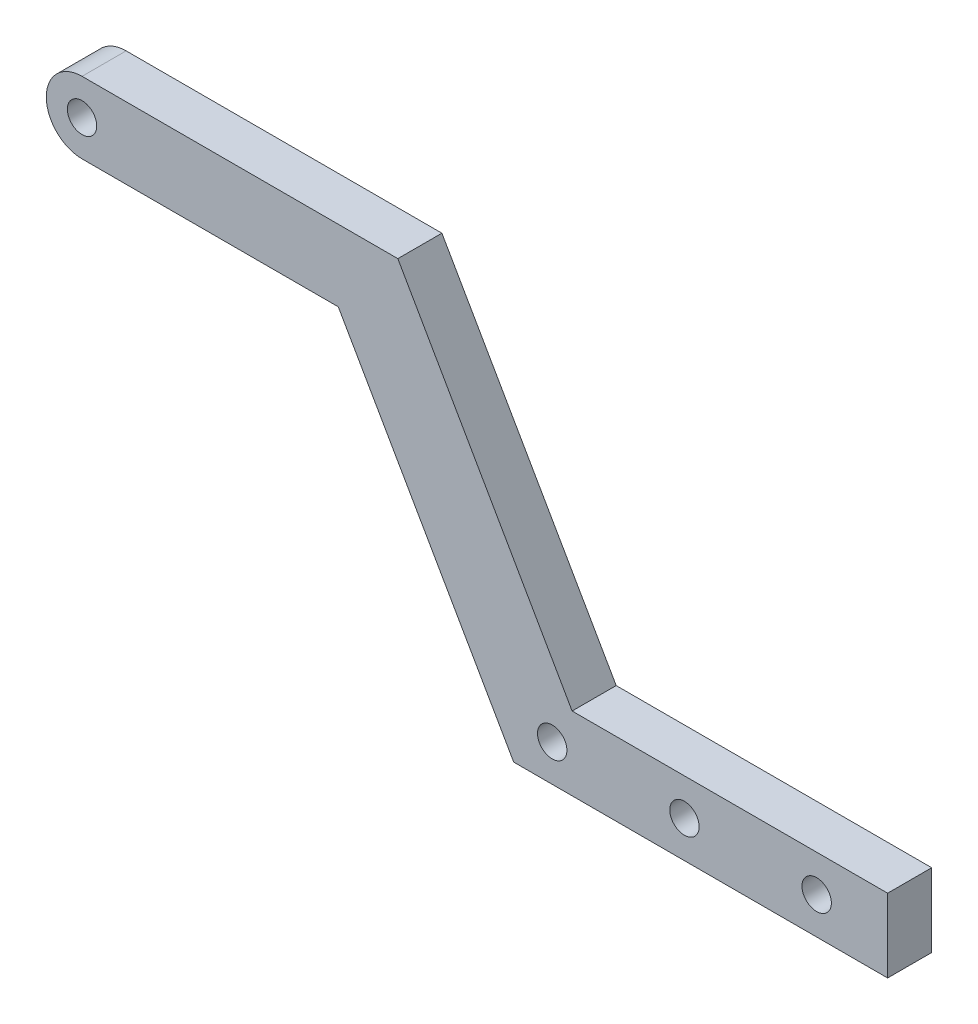
ISO-10303-21;
HEADER;
FILE_DESCRIPTION(('STEP AP214'),'2;1');
FILE_NAME('part.step','',(''),(''),'','','');
FILE_SCHEMA(('AUTOMOTIVE_DESIGN { 1 0 10303 214 1 1 1 1 }'));
ENDSEC;
DATA;
#1=APPLICATION_CONTEXT('core data for automotive mechanical design processes');
#2=APPLICATION_PROTOCOL_DEFINITION('international standard','automotive_design',2000,#1);
#3=PRODUCT_CONTEXT('',#1,'mechanical');
#4=PRODUCT('Part','Part','',(#3));
#5=PRODUCT_RELATED_PRODUCT_CATEGORY('part','',(#4));
#6=PRODUCT_DEFINITION_FORMATION('','',#4);
#7=PRODUCT_DEFINITION_CONTEXT('part definition',#1,'design');
#8=PRODUCT_DEFINITION('design','',#6,#7);
#9=PRODUCT_DEFINITION_SHAPE('','',#8);
#10=(LENGTH_UNIT() NAMED_UNIT(*) SI_UNIT(.MILLI.,.METRE.));
#11=(NAMED_UNIT(*) PLANE_ANGLE_UNIT() SI_UNIT($,.RADIAN.));
#12=(NAMED_UNIT(*) SI_UNIT($,.STERADIAN.) SOLID_ANGLE_UNIT());
#13=UNCERTAINTY_MEASURE_WITH_UNIT(LENGTH_MEASURE(1.E-05),#10,'distance_accuracy_value','');
#14=(GEOMETRIC_REPRESENTATION_CONTEXT(3) GLOBAL_UNCERTAINTY_ASSIGNED_CONTEXT((#13)) GLOBAL_UNIT_ASSIGNED_CONTEXT((#10,
#11,#12)) REPRESENTATION_CONTEXT('',''));
#15=CARTESIAN_POINT('',(0.,0.,0.));
#16=DIRECTION('',(0.,0.,1.));
#17=DIRECTION('',(1.,0.,0.));
#18=AXIS2_PLACEMENT_3D('',#15,#16,#17);
#19=CARTESIAN_POINT('',(-26.2137553952573,10.3587238753529,3.));
#20=DIRECTION('',(0.,0.,-1.));
#21=DIRECTION('',(-1.,0.,0.));
#22=AXIS2_PLACEMENT_3D('',#19,#20,#21);
#23=PLANE('',#22);
#24=DIRECTION('',(1.,0.,0.));
#25=VECTOR('',#24,1.);
#26=CARTESIAN_POINT('',(28.6160004329534,-12.9421296432464,3.));
#27=LINE('',#26,#25);
#28=CARTESIAN_POINT('',(3.16518740529508,-12.9421296432465,3.));
#29=VERTEX_POINT('',#28);
#30=CARTESIAN_POINT('',(28.6160004329534,-12.9421296432464,3.));
#31=VERTEX_POINT('',#30);
#32=EDGE_CURVE('E164',#29,#31,#27,.T.);
#33=ORIENTED_EDGE('',*,*,#32,.T.);
#34=DIRECTION('',(0.,1.,0.));
#35=VECTOR('',#34,1.);
#36=CARTESIAN_POINT('',(28.6160004329534,-12.9421296432464,3.));
#37=LINE('',#36,#35);
#38=CARTESIAN_POINT('',(28.6160004329534,-7.94212964324644,3.));
#39=VERTEX_POINT('',#38);
#40=EDGE_CURVE('E100',#31,#39,#37,.T.);
#41=ORIENTED_EDGE('',*,*,#40,.T.);
#42=DIRECTION('',(-1.,0.,0.));
#43=VECTOR('',#42,1.);
#44=CARTESIAN_POINT('',(28.6160004329534,-7.94212964324644,3.));
#45=LINE('',#44,#43);
#46=CARTESIAN_POINT('',(7.14145654940995,-7.94212964324644,3.));
#47=VERTEX_POINT('',#46);
#48=EDGE_CURVE('E185',#39,#47,#45,.T.);
#49=ORIENTED_EDGE('',*,*,#48,.T.);
#50=DIRECTION('',(-0.49658999272197,0.867985241307935,0.));
#51=VECTOR('',#50,1.);
#52=CARTESIAN_POINT('',(-4.72119716697906,12.7924975129178,3.));
#53=LINE('',#52,#51);
#54=CARTESIAN_POINT('',(-4.72119716697906,12.7924975129178,3.));
#55=VERTEX_POINT('',#54);
#56=EDGE_CURVE('E199',#47,#55,#53,.T.);
#57=ORIENTED_EDGE('',*,*,#56,.T.);
#58=DIRECTION('',(-1.,0.,0.));
#59=VECTOR('',#58,1.);
#60=CARTESIAN_POINT('',(-26.2137553952573,12.7924975129178,3.));
#61=LINE('',#60,#59);
#62=CARTESIAN_POINT('',(-26.2137553952573,12.7924975129178,3.));
#63=VERTEX_POINT('',#62);
#64=EDGE_CURVE('E119',#55,#63,#61,.T.);
#65=ORIENTED_EDGE('',*,*,#64,.T.);
#66=CARTESIAN_POINT('',(-26.2137553952573,10.3587238753529,3.));
#67=DIRECTION('',(0.,0.,1.));
#68=DIRECTION('',(-1.,0.,0.));
#69=AXIS2_PLACEMENT_3D('',#66,#67,#68);
#70=CIRCLE('',#69,2.43377363756496);
#71=CARTESIAN_POINT('',(-26.2137553952573,7.92495023778792,3.));
#72=VERTEX_POINT('',#71);
#73=EDGE_CURVE('E113',#63,#72,#70,.T.);
#74=ORIENTED_EDGE('',*,*,#73,.T.);
#75=DIRECTION('',(1.,0.,0.));
#76=VECTOR('',#75,1.);
#77=CARTESIAN_POINT('',(-26.2137553952573,7.92495023778792,3.));
#78=LINE('',#77,#76);
#79=CARTESIAN_POINT('',(-8.77324490103876,7.92495023778792,3.));
#80=VERTEX_POINT('',#79);
#81=EDGE_CURVE('E117',#72,#80,#78,.T.);
#82=ORIENTED_EDGE('',*,*,#81,.T.);
#83=DIRECTION('',(0.49658999272197,-0.867985241307935,0.));
#84=VECTOR('',#83,1.);
#85=CARTESIAN_POINT('',(3.16518740529508,-12.9421296432465,3.));
#86=LINE('',#85,#84);
#87=EDGE_CURVE('E57',#80,#29,#86,.T.);
#88=ORIENTED_EDGE('',*,*,#87,.T.);
#89=EDGE_LOOP('',(#33,#41,#49,#57,#65,#74,#82,#88));
#90=FACE_BOUND('',#89,.T.);
#91=CARTESIAN_POINT('',(5.78624463404507,-10.4421296432464,3.));
#92=DIRECTION('',(0.,0.,1.));
#93=DIRECTION('',(1.,0.,0.));
#94=AXIS2_PLACEMENT_3D('',#91,#92,#93);
#95=CIRCLE('',#94,1.00001162749187);
#96=CARTESIAN_POINT('',(6.78625626153693,-10.4421296432464,3.));
#97=VERTEX_POINT('',#96);
#98=EDGE_CURVE('E146',#97,#97,#95,.T.);
#99=ORIENTED_EDGE('',*,*,#98,.F.);
#100=EDGE_LOOP('',(#99));
#101=FACE_BOUND('',#100,.T.);
#102=CARTESIAN_POINT('',(14.7862446340451,-10.4421296432464,3.));
#103=DIRECTION('',(0.,0.,1.));
#104=DIRECTION('',(1.,0.,0.));
#105=AXIS2_PLACEMENT_3D('',#102,#103,#104);
#106=CIRCLE('',#105,1.0000101712497);
#107=CARTESIAN_POINT('',(15.7862548052948,-10.4421296432464,3.));
#108=VERTEX_POINT('',#107);
#109=EDGE_CURVE('E213',#108,#108,#106,.T.);
#110=ORIENTED_EDGE('',*,*,#109,.F.);
#111=EDGE_LOOP('',(#110));
#112=FACE_BOUND('',#111,.T.);
#113=CARTESIAN_POINT('',(23.7862446340451,-10.4421296432464,3.));
#114=DIRECTION('',(0.,0.,1.));
#115=DIRECTION('',(1.,0.,0.));
#116=AXIS2_PLACEMENT_3D('',#113,#114,#115);
#117=CIRCLE('',#116,1.00001103415686);
#118=CARTESIAN_POINT('',(24.7862556682019,-10.4421296432464,3.));
#119=VERTEX_POINT('',#118);
#120=EDGE_CURVE('E221',#119,#119,#117,.T.);
#121=ORIENTED_EDGE('',*,*,#120,.F.);
#122=EDGE_LOOP('',(#121));
#123=FACE_BOUND('',#122,.T.);
#124=CARTESIAN_POINT('',(-26.2137553952573,10.3587238753529,3.));
#125=DIRECTION('',(0.,0.,1.));
#126=DIRECTION('',(1.,0.,0.));
#127=AXIS2_PLACEMENT_3D('',#124,#125,#126);
#128=CIRCLE('',#127,1.);
#129=CARTESIAN_POINT('',(-25.2137553952573,10.3587238753529,3.));
#130=VERTEX_POINT('',#129);
#131=EDGE_CURVE('E229',#130,#130,#128,.T.);
#132=ORIENTED_EDGE('',*,*,#131,.F.);
#133=EDGE_LOOP('',(#132));
#134=FACE_BOUND('',#133,.T.);
#135=ADVANCED_FACE('F39',(#90,#101,#112,#123,#134),#23,.F.);
#136=CARTESIAN_POINT('',(-26.2137553952573,10.3587238753529,0.));
#137=DIRECTION('',(0.,0.,-1.));
#138=DIRECTION('',(-1.,0.,0.));
#139=AXIS2_PLACEMENT_3D('',#136,#137,#138);
#140=PLANE('',#139);
#141=CARTESIAN_POINT('',(23.7862446340451,-10.4421296432464,0.));
#142=DIRECTION('',(0.,0.,1.));
#143=DIRECTION('',(1.,0.,0.));
#144=AXIS2_PLACEMENT_3D('',#141,#142,#143);
#145=CIRCLE('',#144,1.00001103415686);
#146=CARTESIAN_POINT('',(24.7862556682019,-10.4421296432464,0.));
#147=VERTEX_POINT('',#146);
#148=EDGE_CURVE('E225',#147,#147,#145,.T.);
#149=ORIENTED_EDGE('',*,*,#148,.T.);
#150=EDGE_LOOP('',(#149));
#151=FACE_BOUND('',#150,.T.);
#152=CARTESIAN_POINT('',(5.78624463404507,-10.4421296432464,0.));
#153=DIRECTION('',(0.,0.,1.));
#154=DIRECTION('',(1.,0.,0.));
#155=AXIS2_PLACEMENT_3D('',#152,#153,#154);
#156=CIRCLE('',#155,1.00001162749187);
#157=CARTESIAN_POINT('',(6.78625626153693,-10.4421296432464,0.));
#158=VERTEX_POINT('',#157);
#159=EDGE_CURVE('E209',#158,#158,#156,.T.);
#160=ORIENTED_EDGE('',*,*,#159,.T.);
#161=EDGE_LOOP('',(#160));
#162=FACE_BOUND('',#161,.T.);
#163=DIRECTION('',(1.,0.,0.));
#164=VECTOR('',#163,1.);
#165=CARTESIAN_POINT('',(28.6160004329534,-12.9421296432464,0.));
#166=LINE('',#165,#164);
#167=CARTESIAN_POINT('',(3.16518740529508,-12.9421296432465,0.));
#168=VERTEX_POINT('',#167);
#169=CARTESIAN_POINT('',(28.6160004329534,-12.9421296432464,0.));
#170=VERTEX_POINT('',#169);
#171=EDGE_CURVE('E141',#168,#170,#166,.T.);
#172=ORIENTED_EDGE('',*,*,#171,.F.);
#173=DIRECTION('',(0.49658999272197,-0.867985241307935,0.));
#174=VECTOR('',#173,1.);
#175=CARTESIAN_POINT('',(3.16518740529508,-12.9421296432465,0.));
#176=LINE('',#175,#174);
#177=CARTESIAN_POINT('',(-8.77324490103876,7.92495023778792,0.));
#178=VERTEX_POINT('',#177);
#179=EDGE_CURVE('E92',#178,#168,#176,.T.);
#180=ORIENTED_EDGE('',*,*,#179,.F.);
#181=DIRECTION('',(1.,0.,0.));
#182=VECTOR('',#181,1.);
#183=CARTESIAN_POINT('',(-26.2137553952573,7.92495023778792,0.));
#184=LINE('',#183,#182);
#185=CARTESIAN_POINT('',(-26.2137553952573,7.92495023778792,0.));
#186=VERTEX_POINT('',#185);
#187=EDGE_CURVE('E86',#186,#178,#184,.T.);
#188=ORIENTED_EDGE('',*,*,#187,.F.);
#189=CARTESIAN_POINT('',(-26.2137553952573,10.3587238753529,0.));
#190=DIRECTION('',(0.,0.,1.));
#191=DIRECTION('',(-1.,0.,0.));
#192=AXIS2_PLACEMENT_3D('',#189,#190,#191);
#193=CIRCLE('',#192,2.43377363756496);
#194=CARTESIAN_POINT('',(-26.2137553952573,12.7924975129178,0.));
#195=VERTEX_POINT('',#194);
#196=EDGE_CURVE('E128',#195,#186,#193,.T.);
#197=ORIENTED_EDGE('',*,*,#196,.F.);
#198=DIRECTION('',(-1.,0.,0.));
#199=VECTOR('',#198,1.);
#200=CARTESIAN_POINT('',(-26.2137553952573,12.7924975129178,0.));
#201=LINE('',#200,#199);
#202=CARTESIAN_POINT('',(-4.72119716697906,12.7924975129178,0.));
#203=VERTEX_POINT('',#202);
#204=EDGE_CURVE('E155',#203,#195,#201,.T.);
#205=ORIENTED_EDGE('',*,*,#204,.F.);
#206=DIRECTION('',(-0.49658999272197,0.867985241307935,0.));
#207=VECTOR('',#206,1.);
#208=CARTESIAN_POINT('',(-4.72119716697906,12.7924975129178,0.));
#209=LINE('',#208,#207);
#210=CARTESIAN_POINT('',(7.14145654940995,-7.94212964324644,0.));
#211=VERTEX_POINT('',#210);
#212=EDGE_CURVE('E152',#211,#203,#209,.T.);
#213=ORIENTED_EDGE('',*,*,#212,.F.);
#214=DIRECTION('',(-1.,0.,0.));
#215=VECTOR('',#214,1.);
#216=CARTESIAN_POINT('',(28.6160004329534,-7.94212964324644,0.));
#217=LINE('',#216,#215);
#218=CARTESIAN_POINT('',(28.6160004329534,-7.94212964324644,0.));
#219=VERTEX_POINT('',#218);
#220=EDGE_CURVE('E149',#219,#211,#217,.T.);
#221=ORIENTED_EDGE('',*,*,#220,.F.);
#222=DIRECTION('',(0.,1.,0.));
#223=VECTOR('',#222,1.);
#224=CARTESIAN_POINT('',(28.6160004329534,-12.9421296432464,0.));
#225=LINE('',#224,#223);
#226=EDGE_CURVE('E145',#170,#219,#225,.T.);
#227=ORIENTED_EDGE('',*,*,#226,.F.);
#228=EDGE_LOOP('',(#172,#180,#188,#197,#205,#213,#221,#227));
#229=FACE_BOUND('',#228,.T.);
#230=CARTESIAN_POINT('',(14.7862446340451,-10.4421296432464,0.));
#231=DIRECTION('',(0.,0.,1.));
#232=DIRECTION('',(1.,0.,0.));
#233=AXIS2_PLACEMENT_3D('',#230,#231,#232);
#234=CIRCLE('',#233,1.0000101712497);
#235=CARTESIAN_POINT('',(15.7862548052948,-10.4421296432464,0.));
#236=VERTEX_POINT('',#235);
#237=EDGE_CURVE('E217',#236,#236,#234,.T.);
#238=ORIENTED_EDGE('',*,*,#237,.T.);
#239=EDGE_LOOP('',(#238));
#240=FACE_BOUND('',#239,.T.);
#241=CARTESIAN_POINT('',(-26.2137553952573,10.3587238753529,0.));
#242=DIRECTION('',(0.,0.,1.));
#243=DIRECTION('',(1.,0.,0.));
#244=AXIS2_PLACEMENT_3D('',#241,#242,#243);
#245=CIRCLE('',#244,1.);
#246=CARTESIAN_POINT('',(-25.2137553952573,10.3587238753529,0.));
#247=VERTEX_POINT('',#246);
#248=EDGE_CURVE('E233',#247,#247,#245,.T.);
#249=ORIENTED_EDGE('',*,*,#248,.T.);
#250=EDGE_LOOP('',(#249));
#251=FACE_BOUND('',#250,.T.);
#252=ADVANCED_FACE('F189',(#151,#162,#229,#240,#251),#140,.T.);
#253=CARTESIAN_POINT('',(28.6160004329534,-12.9421296432464,3.));
#254=DIRECTION('',(0.,1.,0.));
#255=DIRECTION('',(-1.,0.,0.));
#256=AXIS2_PLACEMENT_3D('',#253,#254,#255);
#257=PLANE('',#256);
#258=ORIENTED_EDGE('',*,*,#171,.T.);
#259=DIRECTION('',(0.,0.,-1.));
#260=VECTOR('',#259,1.);
#261=CARTESIAN_POINT('',(28.6160004329534,-12.9421296432464,3.));
#262=LINE('',#261,#260);
#263=EDGE_CURVE('E11',#31,#170,#262,.T.);
#264=ORIENTED_EDGE('',*,*,#263,.F.);
#265=ORIENTED_EDGE('',*,*,#32,.F.);
#266=DIRECTION('',(0.,0.,-1.));
#267=VECTOR('',#266,1.);
#268=CARTESIAN_POINT('',(3.16518740529508,-12.9421296432465,3.));
#269=LINE('',#268,#267);
#270=EDGE_CURVE('E137',#29,#168,#269,.T.);
#271=ORIENTED_EDGE('',*,*,#270,.T.);
#272=EDGE_LOOP('',(#258,#264,#265,#271));
#273=FACE_BOUND('',#272,.T.);
#274=ADVANCED_FACE('F41',(#273),#257,.F.);
#275=CARTESIAN_POINT('',(28.6160004329534,-12.9421296432464,3.));
#276=DIRECTION('',(-1.,0.,0.));
#277=DIRECTION('',(0.,-1.,0.));
#278=AXIS2_PLACEMENT_3D('',#275,#276,#277);
#279=PLANE('',#278);
#280=ORIENTED_EDGE('',*,*,#226,.T.);
#281=DIRECTION('',(0.,0.,-1.));
#282=VECTOR('',#281,1.);
#283=CARTESIAN_POINT('',(28.6160004329534,-7.94212964324644,3.));
#284=LINE('',#283,#282);
#285=EDGE_CURVE('E49',#39,#219,#284,.T.);
#286=ORIENTED_EDGE('',*,*,#285,.F.);
#287=ORIENTED_EDGE('',*,*,#40,.F.);
#288=ORIENTED_EDGE('',*,*,#263,.T.);
#289=EDGE_LOOP('',(#280,#286,#287,#288));
#290=FACE_BOUND('',#289,.T.);
#291=ADVANCED_FACE('F267',(#290),#279,.F.);
#292=CARTESIAN_POINT('',(28.6160004329534,-7.94212964324644,3.));
#293=DIRECTION('',(0.,-1.,0.));
#294=DIRECTION('',(0.,0.,-1.));
#295=AXIS2_PLACEMENT_3D('',#292,#293,#294);
#296=PLANE('',#295);
#297=ORIENTED_EDGE('',*,*,#220,.T.);
#298=DIRECTION('',(0.,0.,-1.));
#299=VECTOR('',#298,1.);
#300=CARTESIAN_POINT('',(7.14145654940995,-7.94212964324644,3.));
#301=LINE('',#300,#299);
#302=EDGE_CURVE('E175',#47,#211,#301,.T.);
#303=ORIENTED_EDGE('',*,*,#302,.F.);
#304=ORIENTED_EDGE('',*,*,#48,.F.);
#305=ORIENTED_EDGE('',*,*,#285,.T.);
#306=EDGE_LOOP('',(#297,#303,#304,#305));
#307=FACE_BOUND('',#306,.T.);
#308=ADVANCED_FACE('F183',(#307),#296,.F.);
#309=CARTESIAN_POINT('',(-4.72119716697906,12.7924975129178,3.));
#310=DIRECTION('',(-0.867985241307935,-0.49658999272197,0.));
#311=DIRECTION('',(0.49658999272197,-0.867985241307935,0.));
#312=AXIS2_PLACEMENT_3D('',#309,#310,#311);
#313=PLANE('',#312);
#314=ORIENTED_EDGE('',*,*,#212,.T.);
#315=DIRECTION('',(0.,0.,-1.));
#316=VECTOR('',#315,1.);
#317=CARTESIAN_POINT('',(-4.72119716697906,12.7924975129178,3.));
#318=LINE('',#317,#316);
#319=EDGE_CURVE('E171',#55,#203,#318,.T.);
#320=ORIENTED_EDGE('',*,*,#319,.F.);
#321=ORIENTED_EDGE('',*,*,#56,.F.);
#322=ORIENTED_EDGE('',*,*,#302,.T.);
#323=EDGE_LOOP('',(#314,#320,#321,#322));
#324=FACE_BOUND('',#323,.T.);
#325=ADVANCED_FACE('F194',(#324),#313,.F.);
#326=CARTESIAN_POINT('',(-26.2137553952573,12.7924975129178,3.));
#327=DIRECTION('',(0.,-1.,0.));
#328=DIRECTION('',(0.,0.,-1.));
#329=AXIS2_PLACEMENT_3D('',#326,#327,#328);
#330=PLANE('',#329);
#331=ORIENTED_EDGE('',*,*,#204,.T.);
#332=DIRECTION('',(0.,0.,-1.));
#333=VECTOR('',#332,1.);
#334=CARTESIAN_POINT('',(-26.2137553952573,12.7924975129178,3.));
#335=LINE('',#334,#333);
#336=EDGE_CURVE('E130',#63,#195,#335,.T.);
#337=ORIENTED_EDGE('',*,*,#336,.F.);
#338=ORIENTED_EDGE('',*,*,#64,.F.);
#339=ORIENTED_EDGE('',*,*,#319,.T.);
#340=EDGE_LOOP('',(#331,#337,#338,#339));
#341=FACE_BOUND('',#340,.T.);
#342=ADVANCED_FACE('F197',(#341),#330,.F.);
#343=CARTESIAN_POINT('',(-26.2137553952573,10.3587238753529,3.));
#344=DIRECTION('',(0.,0.,-1.));
#345=DIRECTION('',(-1.,0.,0.));
#346=AXIS2_PLACEMENT_3D('',#343,#344,#345);
#347=CYLINDRICAL_SURFACE('',#346,2.43377363756496);
#348=ORIENTED_EDGE('',*,*,#196,.T.);
#349=DIRECTION('',(0.,0.,-1.));
#350=VECTOR('',#349,1.);
#351=CARTESIAN_POINT('',(-26.2137553952573,7.92495023778792,3.));
#352=LINE('',#351,#350);
#353=EDGE_CURVE('E125',#72,#186,#352,.T.);
#354=ORIENTED_EDGE('',*,*,#353,.F.);
#355=ORIENTED_EDGE('',*,*,#73,.F.);
#356=ORIENTED_EDGE('',*,*,#336,.T.);
#357=EDGE_LOOP('',(#348,#354,#355,#356));
#358=FACE_BOUND('',#357,.T.);
#359=ADVANCED_FACE('F126',(#358),#347,.T.);
#360=CARTESIAN_POINT('',(-26.2137553952573,7.92495023778792,3.));
#361=DIRECTION('',(0.,1.,0.));
#362=DIRECTION('',(0.,0.,1.));
#363=AXIS2_PLACEMENT_3D('',#360,#361,#362);
#364=PLANE('',#363);
#365=ORIENTED_EDGE('',*,*,#187,.T.);
#366=DIRECTION('',(0.,0.,-1.));
#367=VECTOR('',#366,1.);
#368=CARTESIAN_POINT('',(-8.77324490103876,7.92495023778792,3.));
#369=LINE('',#368,#367);
#370=EDGE_CURVE('E131',#80,#178,#369,.T.);
#371=ORIENTED_EDGE('',*,*,#370,.F.);
#372=ORIENTED_EDGE('',*,*,#81,.F.);
#373=ORIENTED_EDGE('',*,*,#353,.T.);
#374=EDGE_LOOP('',(#365,#371,#372,#373));
#375=FACE_BOUND('',#374,.T.);
#376=ADVANCED_FACE('F133',(#375),#364,.F.);
#377=CARTESIAN_POINT('',(3.16518740529508,-12.9421296432465,3.));
#378=DIRECTION('',(0.867985241307935,0.49658999272197,0.));
#379=DIRECTION('',(-0.49658999272197,0.867985241307935,0.));
#380=AXIS2_PLACEMENT_3D('',#377,#378,#379);
#381=PLANE('',#380);
#382=ORIENTED_EDGE('',*,*,#179,.T.);
#383=ORIENTED_EDGE('',*,*,#270,.F.);
#384=ORIENTED_EDGE('',*,*,#87,.F.);
#385=ORIENTED_EDGE('',*,*,#370,.T.);
#386=EDGE_LOOP('',(#382,#383,#384,#385));
#387=FACE_BOUND('',#386,.T.);
#388=ADVANCED_FACE('F255',(#387),#381,.F.);
#389=CARTESIAN_POINT('',(5.78624463404507,-10.4421296432464,3.));
#390=DIRECTION('',(0.,0.,-1.));
#391=DIRECTION('',(-1.,0.,0.));
#392=AXIS2_PLACEMENT_3D('',#389,#390,#391);
#393=CYLINDRICAL_SURFACE('',#392,1.00001162749187);
#394=ORIENTED_EDGE('',*,*,#98,.T.);
#395=EDGE_LOOP('',(#394));
#396=FACE_BOUND('',#395,.T.);
#397=ORIENTED_EDGE('',*,*,#159,.F.);
#398=EDGE_LOOP('',(#397));
#399=FACE_BOUND('',#398,.T.);
#400=ADVANCED_FACE('F252',(#396,#399),#393,.F.);
#401=CARTESIAN_POINT('',(14.7862446340451,-10.4421296432464,3.));
#402=DIRECTION('',(0.,0.,-1.));
#403=DIRECTION('',(-1.,0.,0.));
#404=AXIS2_PLACEMENT_3D('',#401,#402,#403);
#405=CYLINDRICAL_SURFACE('',#404,1.0000101712497);
#406=ORIENTED_EDGE('',*,*,#109,.T.);
#407=EDGE_LOOP('',(#406));
#408=FACE_BOUND('',#407,.T.);
#409=ORIENTED_EDGE('',*,*,#237,.F.);
#410=EDGE_LOOP('',(#409));
#411=FACE_BOUND('',#410,.T.);
#412=ADVANCED_FACE('F331',(#408,#411),#405,.F.);
#413=CARTESIAN_POINT('',(23.7862446340451,-10.4421296432464,3.));
#414=DIRECTION('',(0.,0.,-1.));
#415=DIRECTION('',(-1.,0.,0.));
#416=AXIS2_PLACEMENT_3D('',#413,#414,#415);
#417=CYLINDRICAL_SURFACE('',#416,1.00001103415686);
#418=ORIENTED_EDGE('',*,*,#120,.T.);
#419=EDGE_LOOP('',(#418));
#420=FACE_BOUND('',#419,.T.);
#421=ORIENTED_EDGE('',*,*,#148,.F.);
#422=EDGE_LOOP('',(#421));
#423=FACE_BOUND('',#422,.T.);
#424=ADVANCED_FACE('F339',(#420,#423),#417,.F.);
#425=CARTESIAN_POINT('',(-26.2137553952573,10.3587238753529,3.));
#426=DIRECTION('',(0.,0.,-1.));
#427=DIRECTION('',(-1.,0.,0.));
#428=AXIS2_PLACEMENT_3D('',#425,#426,#427);
#429=CYLINDRICAL_SURFACE('',#428,1.);
#430=ORIENTED_EDGE('',*,*,#131,.T.);
#431=EDGE_LOOP('',(#430));
#432=FACE_BOUND('',#431,.T.);
#433=ORIENTED_EDGE('',*,*,#248,.F.);
#434=EDGE_LOOP('',(#433));
#435=FACE_BOUND('',#434,.T.);
#436=ADVANCED_FACE('F241',(#432,#435),#429,.F.);
#437=CLOSED_SHELL('',(#135,#252,#274,#291,#308,#325,#342,#359,#376,#388,#400,#412,#424,#436));
#438=MANIFOLD_SOLID_BREP('B2',#437);
#439=ADVANCED_BREP_SHAPE_REPRESENTATION('',(#18,#438),#14);
#440=SHAPE_DEFINITION_REPRESENTATION(#9,#439);
ENDSEC;
END-ISO-10303-21;
